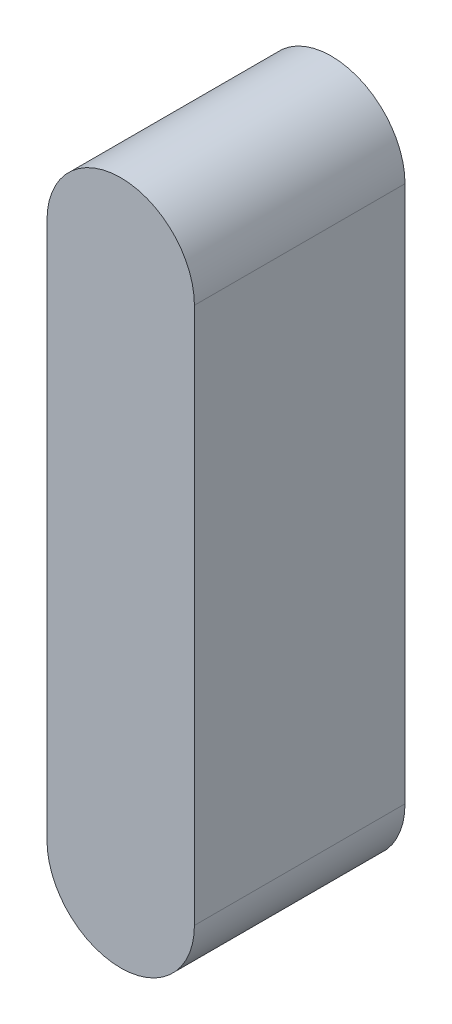
ISO-10303-21;
HEADER;
FILE_DESCRIPTION(('STEP AP214'),'2;1');
FILE_NAME('part.step','',(''),(''),'','','');
FILE_SCHEMA(('AUTOMOTIVE_DESIGN { 1 0 10303 214 1 1 1 1 }'));
ENDSEC;
DATA;
#1=APPLICATION_CONTEXT('core data for automotive mechanical design processes');
#2=APPLICATION_PROTOCOL_DEFINITION('international standard','automotive_design',2000,#1);
#3=PRODUCT_CONTEXT('',#1,'mechanical');
#4=PRODUCT('Part','Part','',(#3));
#5=PRODUCT_RELATED_PRODUCT_CATEGORY('part','',(#4));
#6=PRODUCT_DEFINITION_FORMATION('','',#4);
#7=PRODUCT_DEFINITION_CONTEXT('part definition',#1,'design');
#8=PRODUCT_DEFINITION('design','',#6,#7);
#9=PRODUCT_DEFINITION_SHAPE('','',#8);
#10=(LENGTH_UNIT() NAMED_UNIT(*) SI_UNIT(.MILLI.,.METRE.));
#11=(NAMED_UNIT(*) PLANE_ANGLE_UNIT() SI_UNIT($,.RADIAN.));
#12=(NAMED_UNIT(*) SI_UNIT($,.STERADIAN.) SOLID_ANGLE_UNIT());
#13=UNCERTAINTY_MEASURE_WITH_UNIT(LENGTH_MEASURE(1.E-05),#10,'distance_accuracy_value','');
#14=(GEOMETRIC_REPRESENTATION_CONTEXT(3) GLOBAL_UNCERTAINTY_ASSIGNED_CONTEXT((#13)) GLOBAL_UNIT_ASSIGNED_CONTEXT((#10,
#11,#12)) REPRESENTATION_CONTEXT('',''));
#15=CARTESIAN_POINT('',(0.,0.,0.));
#16=DIRECTION('',(0.,0.,1.));
#17=DIRECTION('',(1.,0.,0.));
#18=AXIS2_PLACEMENT_3D('',#15,#16,#17);
#19=CARTESIAN_POINT('',(1.4,0.,4.));
#20=DIRECTION('',(-1.,0.,0.));
#21=DIRECTION('',(0.,-1.,0.));
#22=AXIS2_PLACEMENT_3D('',#19,#20,#21);
#23=PLANE('',#22);
#24=DIRECTION('',(0.,1.,0.));
#25=VECTOR('',#24,1.);
#26=CARTESIAN_POINT('',(1.4,0.,0.));
#27=LINE('',#26,#25);
#28=CARTESIAN_POINT('',(1.4,-5.1,0.));
#29=VERTEX_POINT('',#28);
#30=CARTESIAN_POINT('',(1.4,5.1,0.));
#31=VERTEX_POINT('',#30);
#32=EDGE_CURVE('E112',#29,#31,#27,.T.);
#33=ORIENTED_EDGE('',*,*,#32,.T.);
#34=DIRECTION('',(0.,0.,-1.));
#35=VECTOR('',#34,1.);
#36=CARTESIAN_POINT('',(1.4,5.1,4.));
#37=LINE('',#36,#35);
#38=CARTESIAN_POINT('',(1.4,5.1,4.));
#39=VERTEX_POINT('',#38);
#40=EDGE_CURVE('E11',#39,#31,#37,.T.);
#41=ORIENTED_EDGE('',*,*,#40,.F.);
#42=DIRECTION('',(0.,1.,0.));
#43=VECTOR('',#42,1.);
#44=CARTESIAN_POINT('',(1.4,0.,4.));
#45=LINE('',#44,#43);
#46=CARTESIAN_POINT('',(1.4,-5.1,4.));
#47=VERTEX_POINT('',#46);
#48=EDGE_CURVE('E93',#47,#39,#45,.T.);
#49=ORIENTED_EDGE('',*,*,#48,.F.);
#50=DIRECTION('',(0.,0.,-1.));
#51=VECTOR('',#50,1.);
#52=CARTESIAN_POINT('',(1.4,-5.1,4.));
#53=LINE('',#52,#51);
#54=EDGE_CURVE('E108',#47,#29,#53,.T.);
#55=ORIENTED_EDGE('',*,*,#54,.T.);
#56=EDGE_LOOP('',(#33,#41,#49,#55));
#57=FACE_BOUND('',#56,.T.);
#58=ADVANCED_FACE('F45',(#57),#23,.F.);
#59=CARTESIAN_POINT('',(0.,5.1,4.));
#60=DIRECTION('',(0.,0.,-1.));
#61=DIRECTION('',(-1.,0.,0.));
#62=AXIS2_PLACEMENT_3D('',#59,#60,#61);
#63=CYLINDRICAL_SURFACE('',#62,1.4);
#64=CARTESIAN_POINT('',(0.,5.1,0.));
#65=DIRECTION('',(0.,0.,1.));
#66=DIRECTION('',(1.,0.,0.));
#67=AXIS2_PLACEMENT_3D('',#64,#65,#66);
#68=CIRCLE('',#67,1.4);
#69=CARTESIAN_POINT('',(-1.4,5.1,0.));
#70=VERTEX_POINT('',#69);
#71=EDGE_CURVE('E99',#31,#70,#68,.T.);
#72=ORIENTED_EDGE('',*,*,#71,.T.);
#73=DIRECTION('',(0.,0.,-1.));
#74=VECTOR('',#73,1.);
#75=CARTESIAN_POINT('',(-1.4,5.1,4.));
#76=LINE('',#75,#74);
#77=CARTESIAN_POINT('',(-1.4,5.1,4.));
#78=VERTEX_POINT('',#77);
#79=EDGE_CURVE('E54',#78,#70,#76,.T.);
#80=ORIENTED_EDGE('',*,*,#79,.F.);
#81=CARTESIAN_POINT('',(0.,5.1,4.));
#82=DIRECTION('',(0.,0.,1.));
#83=DIRECTION('',(1.,0.,0.));
#84=AXIS2_PLACEMENT_3D('',#81,#82,#83);
#85=CIRCLE('',#84,1.4);
#86=EDGE_CURVE('E88',#39,#78,#85,.T.);
#87=ORIENTED_EDGE('',*,*,#86,.F.);
#88=ORIENTED_EDGE('',*,*,#40,.T.);
#89=EDGE_LOOP('',(#72,#80,#87,#88));
#90=FACE_BOUND('',#89,.T.);
#91=ADVANCED_FACE('F98',(#90),#63,.T.);
#92=CARTESIAN_POINT('',(-1.4,0.,4.));
#93=DIRECTION('',(-1.,0.,0.));
#94=DIRECTION('',(0.,-1.,0.));
#95=AXIS2_PLACEMENT_3D('',#92,#93,#94);
#96=PLANE('',#95);
#97=DIRECTION('',(0.,1.,0.));
#98=VECTOR('',#97,1.);
#99=CARTESIAN_POINT('',(-1.4,0.,0.));
#100=LINE('',#99,#98);
#101=CARTESIAN_POINT('',(-1.4,-5.1,0.));
#102=VERTEX_POINT('',#101);
#103=EDGE_CURVE('E118',#102,#70,#100,.T.);
#104=ORIENTED_EDGE('',*,*,#103,.F.);
#105=DIRECTION('',(0.,0.,-1.));
#106=VECTOR('',#105,1.);
#107=CARTESIAN_POINT('',(-1.4,-5.1,4.));
#108=LINE('',#107,#106);
#109=CARTESIAN_POINT('',(-1.4,-5.1,4.));
#110=VERTEX_POINT('',#109);
#111=EDGE_CURVE('E78',#110,#102,#108,.T.);
#112=ORIENTED_EDGE('',*,*,#111,.F.);
#113=DIRECTION('',(0.,1.,0.));
#114=VECTOR('',#113,1.);
#115=CARTESIAN_POINT('',(-1.4,0.,4.));
#116=LINE('',#115,#114);
#117=EDGE_CURVE('E91',#110,#78,#116,.T.);
#118=ORIENTED_EDGE('',*,*,#117,.T.);
#119=ORIENTED_EDGE('',*,*,#79,.T.);
#120=EDGE_LOOP('',(#104,#112,#118,#119));
#121=FACE_BOUND('',#120,.T.);
#122=ADVANCED_FACE('F104',(#121),#96,.T.);
#123=CARTESIAN_POINT('',(0.,-5.1,4.));
#124=DIRECTION('',(0.,0.,-1.));
#125=DIRECTION('',(-1.,0.,0.));
#126=AXIS2_PLACEMENT_3D('',#123,#124,#125);
#127=CYLINDRICAL_SURFACE('',#126,1.4);
#128=CARTESIAN_POINT('',(0.,-5.1,0.));
#129=DIRECTION('',(0.,0.,1.));
#130=DIRECTION('',(1.,0.,0.));
#131=AXIS2_PLACEMENT_3D('',#128,#129,#130);
#132=CIRCLE('',#131,1.4);
#133=EDGE_CURVE('E81',#102,#29,#132,.T.);
#134=ORIENTED_EDGE('',*,*,#133,.T.);
#135=ORIENTED_EDGE('',*,*,#54,.F.);
#136=CARTESIAN_POINT('',(0.,-5.1,4.));
#137=DIRECTION('',(0.,0.,1.));
#138=DIRECTION('',(1.,0.,0.));
#139=AXIS2_PLACEMENT_3D('',#136,#137,#138);
#140=CIRCLE('',#139,1.4);
#141=EDGE_CURVE('E62',#110,#47,#140,.T.);
#142=ORIENTED_EDGE('',*,*,#141,.F.);
#143=ORIENTED_EDGE('',*,*,#111,.T.);
#144=EDGE_LOOP('',(#134,#135,#142,#143));
#145=FACE_BOUND('',#144,.T.);
#146=ADVANCED_FACE('F135',(#145),#127,.T.);
#147=CARTESIAN_POINT('',(0.,0.,4.));
#148=DIRECTION('',(0.,0.,1.));
#149=DIRECTION('',(1.,0.,0.));
#150=AXIS2_PLACEMENT_3D('',#147,#148,#149);
#151=PLANE('',#150);
#152=ORIENTED_EDGE('',*,*,#48,.T.);
#153=ORIENTED_EDGE('',*,*,#86,.T.);
#154=ORIENTED_EDGE('',*,*,#117,.F.);
#155=ORIENTED_EDGE('',*,*,#141,.T.);
#156=EDGE_LOOP('',(#152,#153,#154,#155));
#157=FACE_BOUND('',#156,.T.);
#158=ADVANCED_FACE('F89',(#157),#151,.T.);
#159=CARTESIAN_POINT('',(0.,0.,0.));
#160=DIRECTION('',(0.,0.,1.));
#161=DIRECTION('',(1.,0.,0.));
#162=AXIS2_PLACEMENT_3D('',#159,#160,#161);
#163=PLANE('',#162);
#164=ORIENTED_EDGE('',*,*,#32,.F.);
#165=ORIENTED_EDGE('',*,*,#133,.F.);
#166=ORIENTED_EDGE('',*,*,#103,.T.);
#167=ORIENTED_EDGE('',*,*,#71,.F.);
#168=EDGE_LOOP('',(#164,#165,#166,#167));
#169=FACE_BOUND('',#168,.T.);
#170=ADVANCED_FACE('F129',(#169),#163,.F.);
#171=CLOSED_SHELL('',(#58,#91,#122,#146,#158,#170));
#172=MANIFOLD_SOLID_BREP('B2',#171);
#173=ADVANCED_BREP_SHAPE_REPRESENTATION('',(#18,#172),#14);
#174=SHAPE_DEFINITION_REPRESENTATION(#9,#173);
ENDSEC;
END-ISO-10303-21;
